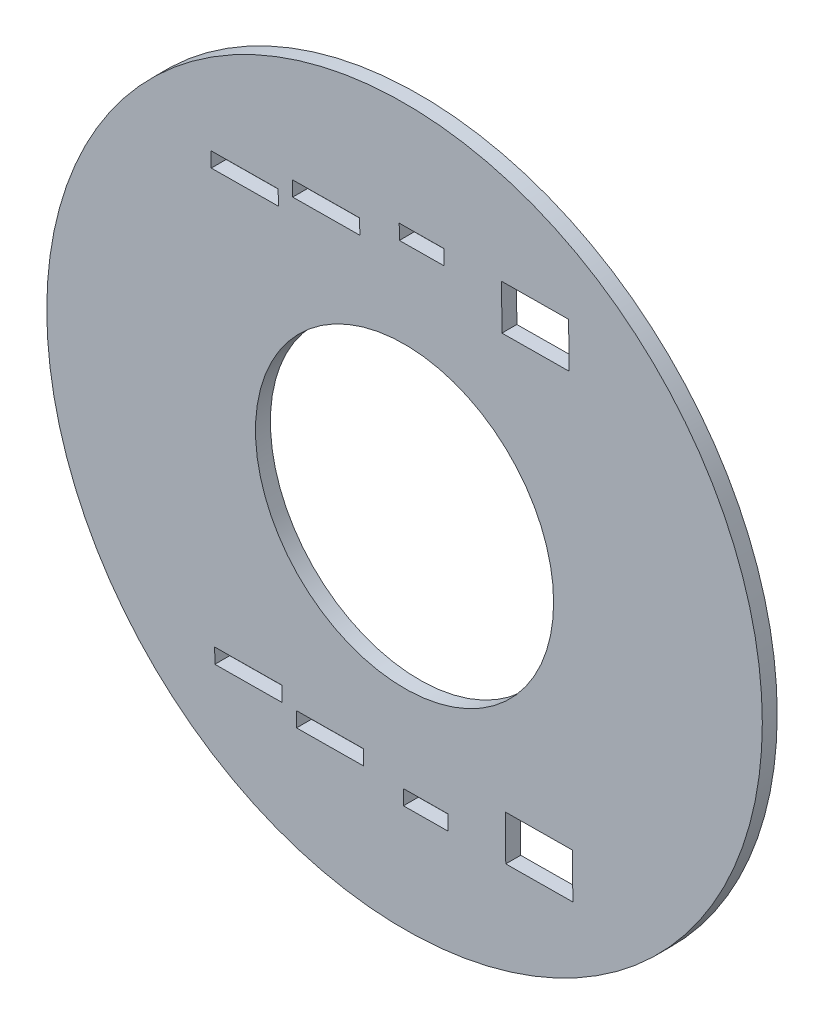
ISO-10303-21;
HEADER;
FILE_DESCRIPTION(('STEP AP214'),'2;1');
FILE_NAME('part.step','',(''),(''),'','','');
FILE_SCHEMA(('AUTOMOTIVE_DESIGN { 1 0 10303 214 1 1 1 1 }'));
ENDSEC;
DATA;
#1=APPLICATION_CONTEXT('core data for automotive mechanical design processes');
#2=APPLICATION_PROTOCOL_DEFINITION('international standard','automotive_design',2000,#1);
#3=PRODUCT_CONTEXT('',#1,'mechanical');
#4=PRODUCT('Part','Part','',(#3));
#5=PRODUCT_RELATED_PRODUCT_CATEGORY('part','',(#4));
#6=PRODUCT_DEFINITION_FORMATION('','',#4);
#7=PRODUCT_DEFINITION_CONTEXT('part definition',#1,'design');
#8=PRODUCT_DEFINITION('design','',#6,#7);
#9=PRODUCT_DEFINITION_SHAPE('','',#8);
#10=(LENGTH_UNIT() NAMED_UNIT(*) SI_UNIT(.MILLI.,.METRE.));
#11=(NAMED_UNIT(*) PLANE_ANGLE_UNIT() SI_UNIT($,.RADIAN.));
#12=(NAMED_UNIT(*) SI_UNIT($,.STERADIAN.) SOLID_ANGLE_UNIT());
#13=UNCERTAINTY_MEASURE_WITH_UNIT(LENGTH_MEASURE(1.E-05),#10,'distance_accuracy_value','');
#14=(GEOMETRIC_REPRESENTATION_CONTEXT(3) GLOBAL_UNCERTAINTY_ASSIGNED_CONTEXT((#13)) GLOBAL_UNIT_ASSIGNED_CONTEXT((#10,
#11,#12)) REPRESENTATION_CONTEXT('',''));
#15=CARTESIAN_POINT('',(0.,0.,0.));
#16=DIRECTION('',(0.,0.,1.));
#17=DIRECTION('',(1.,0.,0.));
#18=AXIS2_PLACEMENT_3D('',#15,#16,#17);
#19=CARTESIAN_POINT('',(0.,0.,3.175));
#20=DIRECTION('',(0.,0.,1.));
#21=DIRECTION('',(1.,0.,0.));
#22=AXIS2_PLACEMENT_3D('',#19,#20,#21);
#23=PLANE('',#22);
#24=DIRECTION('',(0.999964969742603,0.00837014263177071,0.));
#25=VECTOR('',#24,1.);
#26=CARTESIAN_POINT('',(0.447896842525139,-53.5093811763047,3.175));
#27=LINE('',#26,#25);
#28=CARTESIAN_POINT('',(21.5577069753137,-53.3326828647763,3.175));
#29=VERTEX_POINT('',#28);
#30=CARTESIAN_POINT('',(35.8447064805111,-53.2130944519249,3.175));
#31=VERTEX_POINT('',#30);
#32=EDGE_CURVE('E446',#29,#31,#27,.T.);
#33=ORIENTED_EDGE('',*,*,#32,.F.);
#34=DIRECTION('',(-0.00837014263177083,0.999964969742602,0.));
#35=VECTOR('',#34,1.);
#36=CARTESIAN_POINT('',(21.1098101327886,0.176698311528376,3.175));
#37=LINE('',#36,#35);
#38=CARTESIAN_POINT('',(21.4779813667463,-43.8080165279722,3.175));
#39=VERTEX_POINT('',#38);
#40=EDGE_CURVE('E475',#29,#39,#37,.T.);
#41=ORIENTED_EDGE('',*,*,#40,.T.);
#42=DIRECTION('',(-0.999964969742602,-0.00837014263177071,0.));
#43=VECTOR('',#42,1.);
#44=CARTESIAN_POINT('',(0.368171233957474,-43.9847148395006,3.175));
#45=LINE('',#44,#43);
#46=CARTESIAN_POINT('',(35.7649808719438,-43.6884281151208,3.175));
#47=VERTEX_POINT('',#46);
#48=EDGE_CURVE('E451',#47,#39,#45,.T.);
#49=ORIENTED_EDGE('',*,*,#48,.F.);
#50=DIRECTION('',(-0.00837014263177083,0.999964969742602,0.));
#51=VECTOR('',#50,1.);
#52=CARTESIAN_POINT('',(35.396809637986,0.296286724379802,3.175));
#53=LINE('',#52,#51);
#54=EDGE_CURVE('E472',#31,#47,#53,.T.);
#55=ORIENTED_EDGE('',*,*,#54,.F.);
#56=EDGE_LOOP('',(#33,#41,#49,#55));
#57=FACE_BOUND('',#56,.T.);
#58=CARTESIAN_POINT('',(-26.1453503172451,-44.2066445708103,3.175));
#59=VERTEX_POINT('',#58);
#60=CARTESIAN_POINT('',(-40.4323498224425,-44.3262329836617,3.175));
#61=VERTEX_POINT('',#60);
#62=EDGE_CURVE('E449',#59,#61,#45,.T.);
#63=ORIENTED_EDGE('',*,*,#62,.F.);
#64=DIRECTION('',(-0.00837014263177083,0.999964969742602,0.));
#65=VECTOR('',#64,1.);
#66=CARTESIAN_POINT('',(-26.5135215512025,-0.221929731309707,3.175));
#67=LINE('',#66,#65);
#68=CARTESIAN_POINT('',(-26.1187751143892,-47.381533349743,3.175));
#69=VERTEX_POINT('',#68);
#70=EDGE_CURVE('E455',#69,#59,#67,.T.);
#71=ORIENTED_EDGE('',*,*,#70,.F.);
#72=DIRECTION('',(-0.999964969742602,-0.00837014263177071,0.));
#73=VECTOR('',#72,1.);
#74=CARTESIAN_POINT('',(0.394746436813346,-47.1596036184333,3.175));
#75=LINE('',#74,#73);
#76=CARTESIAN_POINT('',(-40.4057746195866,-47.5011217625945,3.175));
#77=VERTEX_POINT('',#76);
#78=EDGE_CURVE('E415',#69,#77,#75,.T.);
#79=ORIENTED_EDGE('',*,*,#78,.T.);
#80=DIRECTION('',(-0.00837014263177083,0.999964969742602,0.));
#81=VECTOR('',#80,1.);
#82=CARTESIAN_POINT('',(-40.8005210564,-0.341518144161133,3.175));
#83=LINE('',#82,#81);
#84=EDGE_CURVE('E452',#77,#61,#83,.T.);
#85=ORIENTED_EDGE('',*,*,#84,.T.);
#86=EDGE_LOOP('',(#63,#71,#79,#85));
#87=FACE_BOUND('',#86,.T.);
#88=CARTESIAN_POINT('',(0.,0.,3.175));
#89=DIRECTION('',(0.,0.,1.));
#90=DIRECTION('',(1.,0.,0.));
#91=AXIS2_PLACEMENT_3D('',#88,#89,#90);
#92=CIRCLE('',#91,76.2);
#93=CARTESIAN_POINT('',(76.2,0.,3.175));
#94=VERTEX_POINT('',#93);
#95=EDGE_CURVE('E488',#94,#94,#92,.T.);
#96=ORIENTED_EDGE('',*,*,#95,.T.);
#97=EDGE_LOOP('',(#96));
#98=FACE_BOUND('',#97,.T.);
#99=CARTESIAN_POINT('',(0.,0.,3.175));
#100=DIRECTION('',(0.,0.,1.));
#101=DIRECTION('',(1.,0.,0.));
#102=AXIS2_PLACEMENT_3D('',#99,#100,#101);
#103=CIRCLE('',#102,31.75);
#104=CARTESIAN_POINT('',(31.75,0.,3.175));
#105=VERTEX_POINT('',#104);
#106=EDGE_CURVE('E482',#105,#105,#103,.T.);
#107=ORIENTED_EDGE('',*,*,#106,.F.);
#108=EDGE_LOOP('',(#107));
#109=FACE_BOUND('',#108,.T.);
#110=DIRECTION('',(-0.999964969742602,-0.00837014263177077,0.));
#111=VECTOR('',#110,1.);
#112=CARTESIAN_POINT('',(0.421321639669305,-50.3344923973762,3.175));
#113=LINE('',#112,#111);
#114=CARTESIAN_POINT('',(-8.71521697122859,-50.4109692077124,3.175));
#115=VERTEX_POINT('',#114);
#116=CARTESIAN_POINT('',(-23.002216476426,-50.5305576205638,3.175));
#117=VERTEX_POINT('',#116);
#118=EDGE_CURVE('E464',#115,#117,#113,.T.);
#119=ORIENTED_EDGE('',*,*,#118,.T.);
#120=DIRECTION('',(-0.00837014263177088,0.999964969742603,0.));
#121=VECTOR('',#120,1.);
#122=CARTESIAN_POINT('',(-23.4235381160953,-0.196065223187675,3.175));
#123=LINE('',#122,#121);
#124=CARTESIAN_POINT('',(-23.0287916792819,-47.3556688416311,3.175));
#125=VERTEX_POINT('',#124);
#126=EDGE_CURVE('E459',#117,#125,#123,.T.);
#127=ORIENTED_EDGE('',*,*,#126,.T.);
#128=DIRECTION('',(-0.999964969742602,-0.00837014263177077,0.));
#129=VECTOR('',#128,1.);
#130=CARTESIAN_POINT('',(0.394746436813433,-47.1596036184434,3.175));
#131=LINE('',#130,#129);
#132=CARTESIAN_POINT('',(-8.74179217408447,-47.2360804287796,3.175));
#133=VERTEX_POINT('',#132);
#134=EDGE_CURVE('E462',#133,#125,#131,.T.);
#135=ORIENTED_EDGE('',*,*,#134,.F.);
#136=DIRECTION('',(-0.00837014263177088,0.999964969742603,0.));
#137=VECTOR('',#136,1.);
#138=CARTESIAN_POINT('',(-9.1365386108979,-0.0764768103362483,3.175));
#139=LINE('',#138,#137);
#140=EDGE_CURVE('E457',#115,#133,#139,.T.);
#141=ORIENTED_EDGE('',*,*,#140,.F.);
#142=EDGE_LOOP('',(#119,#127,#135,#141));
#143=FACE_BOUND('',#142,.T.);
#144=DIRECTION('',(-0.00837014263177083,0.999964969742602,0.));
#145=VECTOR('',#144,1.);
#146=CARTESIAN_POINT('',(-0.68414385932527,-0.00572658228685418,3.175));
#147=LINE('',#146,#145);
#148=CARTESIAN_POINT('',(-0.236247016800126,-53.5151077585916,3.175));
#149=VERTEX_POINT('',#148);
#150=CARTESIAN_POINT('',(-0.262822219655998,-50.3402189796588,3.175));
#151=VERTEX_POINT('',#150);
#152=EDGE_CURVE('E469',#149,#151,#147,.T.);
#153=ORIENTED_EDGE('',*,*,#152,.T.);
#154=DIRECTION('',(0.999964969742603,0.00837014263177071,0.));
#155=VECTOR('',#154,1.);
#156=CARTESIAN_POINT('',(0.421321639669267,-50.3344923973719,3.175));
#157=LINE('',#156,#155);
#158=CARTESIAN_POINT('',(9.26184411714232,-50.2604933710912,3.175));
#159=VERTEX_POINT('',#158);
#160=EDGE_CURVE('E478',#151,#159,#157,.T.);
#161=ORIENTED_EDGE('',*,*,#160,.T.);
#162=DIRECTION('',(-0.00837014263177083,0.999964969742602,0.));
#163=VECTOR('',#162,1.);
#164=CARTESIAN_POINT('',(8.84052247747304,0.0739990262807631,3.175));
#165=LINE('',#164,#163);
#166=CARTESIAN_POINT('',(9.28841931999819,-53.4353821500239,3.175));
#167=VERTEX_POINT('',#166);
#168=EDGE_CURVE('E467',#167,#159,#165,.T.);
#169=ORIENTED_EDGE('',*,*,#168,.F.);
#170=EDGE_CURVE('E448',#149,#167,#27,.T.);
#171=ORIENTED_EDGE('',*,*,#170,.F.);
#172=EDGE_LOOP('',(#153,#161,#169,#171));
#173=FACE_BOUND('',#172,.T.);
#174=DIRECTION('',(-0.00837014263175822,0.999964969742603,0.));
#175=VECTOR('',#174,1.);
#176=CARTESIAN_POINT('',(-26.5135215512025,-0.221929731309373,3.175));
#177=LINE('',#176,#175);
#178=CARTESIAN_POINT('',(-26.8816927851594,43.7627851081907,3.175));
#179=VERTEX_POINT('',#178);
#180=CARTESIAN_POINT('',(-26.9082679880153,46.9376738871234,3.175));
#181=VERTEX_POINT('',#180);
#182=EDGE_CURVE('E261',#179,#181,#177,.T.);
#183=ORIENTED_EDGE('',*,*,#182,.F.);
#184=DIRECTION('',(-0.999964969742603,-0.00837014263175817,0.));
#185=VECTOR('',#184,1.);
#186=CARTESIAN_POINT('',(-0.368171233956917,43.9847148395001,3.175));
#187=LINE('',#186,#185);
#188=CARTESIAN_POINT('',(-41.1686922903569,43.6431966953394,3.175));
#189=VERTEX_POINT('',#188);
#190=EDGE_CURVE('E334',#179,#189,#187,.T.);
#191=ORIENTED_EDGE('',*,*,#190,.T.);
#192=DIRECTION('',(-0.00837014263175822,0.999964969742603,0.));
#193=VECTOR('',#192,1.);
#194=CARTESIAN_POINT('',(-40.8005210563999,-0.341518144160618,3.175));
#195=LINE('',#194,#193);
#196=CARTESIAN_POINT('',(-41.1952674932127,46.8180854742722,3.175));
#197=VERTEX_POINT('',#196);
#198=EDGE_CURVE('E338',#189,#197,#195,.T.);
#199=ORIENTED_EDGE('',*,*,#198,.T.);
#200=DIRECTION('',(-0.999964969742603,-0.00837014263175817,0.));
#201=VECTOR('',#200,1.);
#202=CARTESIAN_POINT('',(-0.394746436812749,47.1596036184328,3.175));
#203=LINE('',#202,#201);
#204=EDGE_CURVE('E252',#181,#197,#203,.T.);
#205=ORIENTED_EDGE('',*,*,#204,.F.);
#206=EDGE_LOOP('',(#183,#191,#199,#205));
#207=FACE_BOUND('',#206,.T.);
#208=DIRECTION('',(-0.00837014263175822,0.999964969742603,0.));
#209=VECTOR('',#208,1.);
#210=CARTESIAN_POINT('',(21.1098101327889,0.176698311528113,3.175));
#211=LINE('',#210,#209);
#212=CARTESIAN_POINT('',(20.741638898832,44.1614131510282,3.175));
#213=VERTEX_POINT('',#212);
#214=CARTESIAN_POINT('',(20.6619132902645,53.6860794878264,3.175));
#215=VERTEX_POINT('',#214);
#216=EDGE_CURVE('E359',#213,#215,#211,.T.);
#217=ORIENTED_EDGE('',*,*,#216,.T.);
#218=DIRECTION('',(0.999964969742603,0.00837014263175817,0.));
#219=VECTOR('',#218,1.);
#220=CARTESIAN_POINT('',(-0.447896842524414,53.5093811762983,3.175));
#221=LINE('',#220,#219);
#222=CARTESIAN_POINT('',(34.948912795462,53.8056679006777,3.175));
#223=VERTEX_POINT('',#222);
#224=EDGE_CURVE('E330',#215,#223,#221,.T.);
#225=ORIENTED_EDGE('',*,*,#224,.T.);
#226=DIRECTION('',(-0.00837014263175822,0.999964969742603,0.));
#227=VECTOR('',#226,1.);
#228=CARTESIAN_POINT('',(35.3968096379864,0.296286724379359,3.175));
#229=LINE('',#228,#227);
#230=CARTESIAN_POINT('',(35.0286384040294,44.2810015638794,3.175));
#231=VERTEX_POINT('',#230);
#232=EDGE_CURVE('E357',#231,#223,#229,.T.);
#233=ORIENTED_EDGE('',*,*,#232,.F.);
#234=EDGE_CURVE('E337',#231,#213,#187,.T.);
#235=ORIENTED_EDGE('',*,*,#234,.T.);
#236=EDGE_LOOP('',(#217,#225,#233,#235));
#237=FACE_BOUND('',#236,.T.);
#238=DIRECTION('',(-0.999964969742603,-0.00837014263175822,0.));
#239=VECTOR('',#238,1.);
#240=CARTESIAN_POINT('',(-0.394746436812752,47.1596036184328,3.175));
#241=LINE('',#240,#239);
#242=CARTESIAN_POINT('',(-9.53128504771036,47.0831268080967,3.175));
#243=VERTEX_POINT('',#242);
#244=CARTESIAN_POINT('',(-23.8182845529078,46.9635383952455,3.175));
#245=VERTEX_POINT('',#244);
#246=EDGE_CURVE('E347',#243,#245,#241,.T.);
#247=ORIENTED_EDGE('',*,*,#246,.T.);
#248=DIRECTION('',(-0.00837014263175822,0.999964969742603,0.));
#249=VECTOR('',#248,1.);
#250=CARTESIAN_POINT('',(-23.423538116095,-0.196065223187376,3.175));
#251=LINE('',#250,#249);
#252=CARTESIAN_POINT('',(-23.8448597557636,50.1384271741782,3.175));
#253=VERTEX_POINT('',#252);
#254=EDGE_CURVE('E344',#245,#253,#251,.T.);
#255=ORIENTED_EDGE('',*,*,#254,.T.);
#256=DIRECTION('',(-0.999964969742603,-0.00837014263175822,0.));
#257=VECTOR('',#256,1.);
#258=CARTESIAN_POINT('',(-0.421321639668585,50.3344923973656,3.175));
#259=LINE('',#258,#257);
#260=CARTESIAN_POINT('',(-9.55786025056619,50.2580155870295,3.175));
#261=VERTEX_POINT('',#260);
#262=EDGE_CURVE('E350',#261,#253,#259,.T.);
#263=ORIENTED_EDGE('',*,*,#262,.F.);
#264=DIRECTION('',(-0.00837014263175822,0.999964969742603,0.));
#265=VECTOR('',#264,1.);
#266=CARTESIAN_POINT('',(-9.13653861089761,-0.0764768103361302,3.175));
#267=LINE('',#266,#265);
#268=EDGE_CURVE('E342',#243,#261,#267,.T.);
#269=ORIENTED_EDGE('',*,*,#268,.F.);
#270=EDGE_LOOP('',(#247,#255,#263,#269));
#271=FACE_BOUND('',#270,.T.);
#272=DIRECTION('',(0.999964969742603,0.00837014263175817,0.));
#273=VECTOR('',#272,1.);
#274=CARTESIAN_POINT('',(-0.421321639668582,50.3344923973656,3.175));
#275=LINE('',#274,#273);
#276=CARTESIAN_POINT('',(-1.1054654989935,50.3287658150787,3.175));
#277=VERTEX_POINT('',#276);
#278=CARTESIAN_POINT('',(8.41920083780481,50.4084914236462,3.175));
#279=VERTEX_POINT('',#278);
#280=EDGE_CURVE('E362',#277,#279,#275,.T.);
#281=ORIENTED_EDGE('',*,*,#280,.F.);
#282=DIRECTION('',(-0.00837014263175822,0.999964969742603,0.));
#283=VECTOR('',#282,1.);
#284=CARTESIAN_POINT('',(-0.684143859324913,-0.00572658228684257,3.175));
#285=LINE('',#284,#283);
#286=CARTESIAN_POINT('',(-1.13204070184933,53.5036545940115,3.175));
#287=VERTEX_POINT('',#286);
#288=EDGE_CURVE('E354',#277,#287,#285,.T.);
#289=ORIENTED_EDGE('',*,*,#288,.T.);
#290=CARTESIAN_POINT('',(8.39262563494898,53.583380202579,3.175));
#291=VERTEX_POINT('',#290);
#292=EDGE_CURVE('E333',#287,#291,#221,.T.);
#293=ORIENTED_EDGE('',*,*,#292,.T.);
#294=DIRECTION('',(-0.00837014263175822,0.999964969742603,0.));
#295=VECTOR('',#294,1.);
#296=CARTESIAN_POINT('',(8.8405224774734,0.0739990262806547,3.175));
#297=LINE('',#296,#295);
#298=EDGE_CURVE('E352',#279,#291,#297,.T.);
#299=ORIENTED_EDGE('',*,*,#298,.F.);
#300=EDGE_LOOP('',(#281,#289,#293,#299));
#301=FACE_BOUND('',#300,.T.);
#302=ADVANCED_FACE('F33',(#57,#87,#98,#109,#143,#173,#207,#237,#271,#301),#23,.T.);
#303=CARTESIAN_POINT('',(0.,0.,0.));
#304=DIRECTION('',(0.,0.,1.));
#305=DIRECTION('',(1.,0.,0.));
#306=AXIS2_PLACEMENT_3D('',#303,#304,#305);
#307=PLANE('',#306);
#308=DIRECTION('',(0.999964969742603,0.00837014263175817,0.));
#309=VECTOR('',#308,1.);
#310=CARTESIAN_POINT('',(-0.447896842524414,53.5093811762983,0.));
#311=LINE('',#310,#309);
#312=CARTESIAN_POINT('',(-1.13204070184933,53.5036545940115,0.));
#313=VERTEX_POINT('',#312);
#314=CARTESIAN_POINT('',(8.39262563494898,53.583380202579,0.));
#315=VERTEX_POINT('',#314);
#316=EDGE_CURVE('E329',#313,#315,#311,.T.);
#317=ORIENTED_EDGE('',*,*,#316,.F.);
#318=DIRECTION('',(0.00837014263175817,-0.999964969742603,0.));
#319=VECTOR('',#318,1.);
#320=CARTESIAN_POINT('',(-1.13204070184933,53.5036545940115,0.));
#321=LINE('',#320,#319);
#322=CARTESIAN_POINT('',(-1.10546549899351,50.3287658150788,0.));
#323=VERTEX_POINT('',#322);
#324=EDGE_CURVE('E310',#313,#323,#321,.T.);
#325=ORIENTED_EDGE('',*,*,#324,.T.);
#326=DIRECTION('',(0.999964969742603,0.00837014263175822,0.));
#327=VECTOR('',#326,1.);
#328=CARTESIAN_POINT('',(-30.9883595083624,50.0786329677526,0.));
#329=LINE('',#328,#327);
#330=CARTESIAN_POINT('',(8.41920083780479,50.4084914236462,0.));
#331=VERTEX_POINT('',#330);
#332=EDGE_CURVE('E253',#323,#331,#329,.T.);
#333=ORIENTED_EDGE('',*,*,#332,.T.);
#334=DIRECTION('',(0.00837014263175817,-0.999964969742603,0.));
#335=VECTOR('',#334,1.);
#336=CARTESIAN_POINT('',(8.39262563494898,53.583380202579,0.));
#337=LINE('',#336,#335);
#338=EDGE_CURVE('E308',#315,#331,#337,.T.);
#339=ORIENTED_EDGE('',*,*,#338,.F.);
#340=EDGE_LOOP('',(#317,#325,#333,#339));
#341=FACE_BOUND('',#340,.T.);
#342=CARTESIAN_POINT('',(20.6619132902645,53.6860794878264,0.));
#343=VERTEX_POINT('',#342);
#344=CARTESIAN_POINT('',(34.948912795462,53.8056679006777,6.03683769639929E-13));
#345=VERTEX_POINT('',#344);
#346=EDGE_CURVE('E327',#343,#345,#311,.T.);
#347=ORIENTED_EDGE('',*,*,#346,.F.);
#348=DIRECTION('',(0.00837014263175817,-0.999964969742603,0.));
#349=VECTOR('',#348,1.);
#350=CARTESIAN_POINT('',(20.6619132902645,53.6860794878264,0.));
#351=LINE('',#350,#349);
#352=CARTESIAN_POINT('',(20.741638898832,44.1614131510281,0.));
#353=VERTEX_POINT('',#352);
#354=EDGE_CURVE('E306',#343,#353,#351,.T.);
#355=ORIENTED_EDGE('',*,*,#354,.T.);
#356=DIRECTION('',(-0.999964969742603,-0.00837014263175817,0.));
#357=VECTOR('',#356,1.);
#358=CARTESIAN_POINT('',(-0.368171233956917,43.9847148395001,0.));
#359=LINE('',#358,#357);
#360=CARTESIAN_POINT('',(35.0286384040294,44.2810015638794,0.));
#361=VERTEX_POINT('',#360);
#362=EDGE_CURVE('E41',#361,#353,#359,.T.);
#363=ORIENTED_EDGE('',*,*,#362,.F.);
#364=DIRECTION('',(0.00837014263175817,-0.999964969742603,0.));
#365=VECTOR('',#364,1.);
#366=CARTESIAN_POINT('',(34.948912795462,53.8056679006777,6.03683769639929E-13));
#367=LINE('',#366,#365);
#368=EDGE_CURVE('E319',#345,#361,#367,.T.);
#369=ORIENTED_EDGE('',*,*,#368,.F.);
#370=EDGE_LOOP('',(#347,#355,#363,#369));
#371=FACE_BOUND('',#370,.T.);
#372=CARTESIAN_POINT('',(0.,0.,0.));
#373=DIRECTION('',(0.,0.,1.));
#374=DIRECTION('',(1.,0.,0.));
#375=AXIS2_PLACEMENT_3D('',#372,#373,#374);
#376=CIRCLE('',#375,76.2);
#377=CARTESIAN_POINT('',(76.2,0.,0.));
#378=VERTEX_POINT('',#377);
#379=EDGE_CURVE('E485',#378,#378,#376,.T.);
#380=ORIENTED_EDGE('',*,*,#379,.F.);
#381=EDGE_LOOP('',(#380));
#382=FACE_BOUND('',#381,.T.);
#383=DIRECTION('',(0.00837014263175822,-0.999964969742603,0.));
#384=VECTOR('',#383,1.);
#385=CARTESIAN_POINT('',(-9.55786025056619,50.2580155870295,0.));
#386=LINE('',#385,#384);
#387=CARTESIAN_POINT('',(-9.55786025056619,50.2580155870295,0.));
#388=VERTEX_POINT('',#387);
#389=CARTESIAN_POINT('',(-9.53128504770669,47.0831268080967,0.));
#390=VERTEX_POINT('',#389);
#391=EDGE_CURVE('E295',#388,#390,#386,.T.);
#392=ORIENTED_EDGE('',*,*,#391,.F.);
#393=DIRECTION('',(-0.999964969742603,-0.00837014263175822,0.));
#394=VECTOR('',#393,1.);
#395=CARTESIAN_POINT('',(-0.421321639668585,50.3344923973656,0.));
#396=LINE('',#395,#394);
#397=CARTESIAN_POINT('',(-23.8448597557636,50.1384271741782,0.));
#398=VERTEX_POINT('',#397);
#399=EDGE_CURVE('E11',#388,#398,#396,.T.);
#400=ORIENTED_EDGE('',*,*,#399,.T.);
#401=DIRECTION('',(0.00837014263175822,-0.999964969742603,0.));
#402=VECTOR('',#401,1.);
#403=CARTESIAN_POINT('',(-23.8448597557636,50.1384271741782,0.));
#404=LINE('',#403,#402);
#405=CARTESIAN_POINT('',(-23.8182845529078,46.9635383952454,0.));
#406=VERTEX_POINT('',#405);
#407=EDGE_CURVE('E289',#398,#406,#404,.T.);
#408=ORIENTED_EDGE('',*,*,#407,.T.);
#409=DIRECTION('',(0.999964969742603,0.00837014263175823,0.));
#410=VECTOR('',#409,1.);
#411=CARTESIAN_POINT('',(-60.2446001668093,46.6586342571372,0.));
#412=LINE('',#411,#410);
#413=EDGE_CURVE('E275',#406,#390,#412,.T.);
#414=ORIENTED_EDGE('',*,*,#413,.T.);
#415=EDGE_LOOP('',(#392,#400,#408,#414));
#416=FACE_BOUND('',#415,.T.);
#417=CARTESIAN_POINT('',(0.,0.,0.));
#418=DIRECTION('',(0.,0.,1.));
#419=DIRECTION('',(1.,0.,0.));
#420=AXIS2_PLACEMENT_3D('',#417,#418,#419);
#421=CIRCLE('',#420,31.75);
#422=CARTESIAN_POINT('',(31.75,0.,0.));
#423=VERTEX_POINT('',#422);
#424=EDGE_CURVE('E481',#423,#423,#421,.T.);
#425=ORIENTED_EDGE('',*,*,#424,.T.);
#426=EDGE_LOOP('',(#425));
#427=FACE_BOUND('',#426,.T.);
#428=DIRECTION('',(0.00837014263177072,-0.999964969742603,0.));
#429=VECTOR('',#428,1.);
#430=CARTESIAN_POINT('',(-40.4323498224425,-44.3262329836617,0.));
#431=LINE('',#430,#429);
#432=CARTESIAN_POINT('',(-40.4323498224425,-44.3262329836617,0.));
#433=VERTEX_POINT('',#432);
#434=CARTESIAN_POINT('',(-40.4057746195866,-47.5011217625945,0.));
#435=VERTEX_POINT('',#434);
#436=EDGE_CURVE('E372',#433,#435,#431,.T.);
#437=ORIENTED_EDGE('',*,*,#436,.T.);
#438=DIRECTION('',(0.999964969742603,0.00837014263177088,0.));
#439=VECTOR('',#438,1.);
#440=CARTESIAN_POINT('',(-30.1722914318806,-47.4154630480568,0.));
#441=LINE('',#440,#439);
#442=CARTESIAN_POINT('',(-26.1187751143891,-47.3815333497531,0.));
#443=VERTEX_POINT('',#442);
#444=EDGE_CURVE('E382',#435,#443,#441,.T.);
#445=ORIENTED_EDGE('',*,*,#444,.T.);
#446=DIRECTION('',(0.00837014263177072,-0.999964969742603,0.));
#447=VECTOR('',#446,1.);
#448=CARTESIAN_POINT('',(-26.1453503172451,-44.2066445708103,0.));
#449=LINE('',#448,#447);
#450=CARTESIAN_POINT('',(-26.1453503172451,-44.2066445708103,0.));
#451=VERTEX_POINT('',#450);
#452=EDGE_CURVE('E380',#451,#443,#449,.T.);
#453=ORIENTED_EDGE('',*,*,#452,.F.);
#454=DIRECTION('',(-0.999964969742602,-0.00837014263177071,0.));
#455=VECTOR('',#454,1.);
#456=CARTESIAN_POINT('',(0.368171233957474,-43.9847148395006,0.));
#457=LINE('',#456,#455);
#458=EDGE_CURVE('E491',#451,#433,#457,.T.);
#459=ORIENTED_EDGE('',*,*,#458,.T.);
#460=EDGE_LOOP('',(#437,#445,#453,#459));
#461=FACE_BOUND('',#460,.T.);
#462=DIRECTION('',(-0.999964969742602,-0.00837014263177077,0.));
#463=VECTOR('',#462,1.);
#464=CARTESIAN_POINT('',(0.421321639669305,-50.3344923973762,0.));
#465=LINE('',#464,#463);
#466=CARTESIAN_POINT('',(-8.7152169712286,-50.4109692077124,0.));
#467=VERTEX_POINT('',#466);
#468=CARTESIAN_POINT('',(-23.002216476426,-50.5305576205638,0.));
#469=VERTEX_POINT('',#468);
#470=EDGE_CURVE('E497',#467,#469,#465,.T.);
#471=ORIENTED_EDGE('',*,*,#470,.F.);
#472=DIRECTION('',(0.00837014263177077,-0.999964969742603,0.));
#473=VECTOR('',#472,1.);
#474=CARTESIAN_POINT('',(-8.74179217408447,-47.2360804287796,0.));
#475=LINE('',#474,#473);
#476=CARTESIAN_POINT('',(-8.74179217408447,-47.2360804287796,0.));
#477=VERTEX_POINT('',#476);
#478=EDGE_CURVE('E402',#477,#467,#475,.T.);
#479=ORIENTED_EDGE('',*,*,#478,.F.);
#480=DIRECTION('',(0.999964969742603,0.00837014263177083,0.));
#481=VECTOR('',#480,1.);
#482=CARTESIAN_POINT('',(-59.4551072931832,-47.6605729797297,0.));
#483=LINE('',#482,#481);
#484=CARTESIAN_POINT('',(-23.0287916792819,-47.3556688416311,0.));
#485=VERTEX_POINT('',#484);
#486=EDGE_CURVE('E364',#485,#477,#483,.T.);
#487=ORIENTED_EDGE('',*,*,#486,.F.);
#488=DIRECTION('',(0.00837014263177077,-0.999964969742603,0.));
#489=VECTOR('',#488,1.);
#490=CARTESIAN_POINT('',(-23.0287916792819,-47.3556688416311,0.));
#491=LINE('',#490,#489);
#492=EDGE_CURVE('E395',#485,#469,#491,.T.);
#493=ORIENTED_EDGE('',*,*,#492,.T.);
#494=EDGE_LOOP('',(#471,#479,#487,#493));
#495=FACE_BOUND('',#494,.T.);
#496=DIRECTION('',(0.00837014263177072,-0.999964969742603,0.));
#497=VECTOR('',#496,1.);
#498=CARTESIAN_POINT('',(21.5311317724578,-50.1577940858436,0.));
#499=LINE('',#498,#497);
#500=CARTESIAN_POINT('',(21.4779813667463,-43.8080165279722,0.));
#501=VERTEX_POINT('',#500);
#502=CARTESIAN_POINT('',(21.5577069753137,-53.3326828647763,0.));
#503=VERTEX_POINT('',#502);
#504=EDGE_CURVE('E416',#501,#503,#499,.T.);
#505=ORIENTED_EDGE('',*,*,#504,.T.);
#506=DIRECTION('',(0.999964969742603,0.00837014263177071,0.));
#507=VECTOR('',#506,1.);
#508=CARTESIAN_POINT('',(0.447896842525139,-53.5093811763047,0.));
#509=LINE('',#508,#507);
#510=CARTESIAN_POINT('',(35.8447064805111,-53.2130944519249,6.31439345255558E-13));
#511=VERTEX_POINT('',#510);
#512=EDGE_CURVE('E442',#503,#511,#509,.T.);
#513=ORIENTED_EDGE('',*,*,#512,.T.);
#514=DIRECTION('',(0.00837014263177072,-0.999964969742603,0.));
#515=VECTOR('',#514,1.);
#516=CARTESIAN_POINT('',(35.8181312776553,-50.0382056729921,6.31439345255558E-13));
#517=LINE('',#516,#515);
#518=CARTESIAN_POINT('',(35.7649808719438,-43.6884281151208,0.));
#519=VERTEX_POINT('',#518);
#520=EDGE_CURVE('E432',#519,#511,#517,.T.);
#521=ORIENTED_EDGE('',*,*,#520,.F.);
#522=EDGE_CURVE('E494',#519,#501,#457,.T.);
#523=ORIENTED_EDGE('',*,*,#522,.T.);
#524=EDGE_LOOP('',(#505,#513,#521,#523));
#525=FACE_BOUND('',#524,.T.);
#526=DIRECTION('',(0.00837014263177072,-0.999964969742603,0.));
#527=VECTOR('',#526,1.);
#528=CARTESIAN_POINT('',(-0.262822219655998,-50.3402189796588,0.));
#529=LINE('',#528,#527);
#530=CARTESIAN_POINT('',(-0.262822219655998,-50.3402189796588,0.));
#531=VERTEX_POINT('',#530);
#532=CARTESIAN_POINT('',(-0.236247016800126,-53.5151077585916,0.));
#533=VERTEX_POINT('',#532);
#534=EDGE_CURVE('E421',#531,#533,#529,.T.);
#535=ORIENTED_EDGE('',*,*,#534,.T.);
#536=CARTESIAN_POINT('',(9.28841931999819,-53.4353821500239,0.));
#537=VERTEX_POINT('',#536);
#538=EDGE_CURVE('E445',#533,#537,#509,.T.);
#539=ORIENTED_EDGE('',*,*,#538,.T.);
#540=DIRECTION('',(0.00837014263177072,-0.999964969742603,0.));
#541=VECTOR('',#540,1.);
#542=CARTESIAN_POINT('',(9.26184411714232,-50.2604933710912,0.));
#543=LINE('',#542,#541);
#544=CARTESIAN_POINT('',(9.26184411714232,-50.2604933710912,0.));
#545=VERTEX_POINT('',#544);
#546=EDGE_CURVE('E418',#545,#537,#543,.T.);
#547=ORIENTED_EDGE('',*,*,#546,.F.);
#548=DIRECTION('',(0.999964969742603,0.00837014263177088,0.));
#549=VECTOR('',#548,1.);
#550=CARTESIAN_POINT('',(-30.1457162290248,-50.5903518269895,0.));
#551=LINE('',#550,#549);
#552=EDGE_CURVE('E411',#531,#545,#551,.T.);
#553=ORIENTED_EDGE('',*,*,#552,.F.);
#554=EDGE_LOOP('',(#535,#539,#547,#553));
#555=FACE_BOUND('',#554,.T.);
#556=DIRECTION('',(0.00837014263175817,-0.999964969742603,0.));
#557=VECTOR('',#556,1.);
#558=CARTESIAN_POINT('',(-26.9082679880153,46.9376738871234,0.));
#559=LINE('',#558,#557);
#560=CARTESIAN_POINT('',(-26.9082679880153,46.9376738871234,0.));
#561=VERTEX_POINT('',#560);
#562=CARTESIAN_POINT('',(-26.8816927851594,43.7627851081907,0.));
#563=VERTEX_POINT('',#562);
#564=EDGE_CURVE('E258',#561,#563,#559,.T.);
#565=ORIENTED_EDGE('',*,*,#564,.F.);
#566=DIRECTION('',(-0.999964969742603,-0.00837014263175817,0.));
#567=VECTOR('',#566,1.);
#568=CARTESIAN_POINT('',(-0.394746436812749,47.1596036184328,0.));
#569=LINE('',#568,#567);
#570=CARTESIAN_POINT('',(-41.1952674932127,46.8180854742722,0.));
#571=VERTEX_POINT('',#570);
#572=EDGE_CURVE('E241',#561,#571,#569,.T.);
#573=ORIENTED_EDGE('',*,*,#572,.T.);
#574=DIRECTION('',(0.00837014263175817,-0.999964969742603,0.));
#575=VECTOR('',#574,1.);
#576=CARTESIAN_POINT('',(-41.1952674932127,46.8180854742722,0.));
#577=LINE('',#576,#575);
#578=CARTESIAN_POINT('',(-41.1686922903569,43.6431966953394,0.));
#579=VERTEX_POINT('',#578);
#580=EDGE_CURVE('E268',#571,#579,#577,.T.);
#581=ORIENTED_EDGE('',*,*,#580,.T.);
#582=EDGE_CURVE('E267',#563,#579,#359,.T.);
#583=ORIENTED_EDGE('',*,*,#582,.F.);
#584=EDGE_LOOP('',(#565,#573,#581,#583));
#585=FACE_BOUND('',#584,.T.);
#586=ADVANCED_FACE('F266',(#341,#371,#382,#416,#427,#461,#495,#525,#555,#585),#307,.F.);
#587=CARTESIAN_POINT('',(0.,0.,3.175));
#588=DIRECTION('',(0.,0.,-1.));
#589=DIRECTION('',(-1.,0.,0.));
#590=AXIS2_PLACEMENT_3D('',#587,#588,#589);
#591=CYLINDRICAL_SURFACE('',#590,76.2);
#592=ORIENTED_EDGE('',*,*,#95,.F.);
#593=EDGE_LOOP('',(#592));
#594=FACE_BOUND('',#593,.T.);
#595=ORIENTED_EDGE('',*,*,#379,.T.);
#596=EDGE_LOOP('',(#595));
#597=FACE_BOUND('',#596,.T.);
#598=ADVANCED_FACE('F35',(#594,#597),#591,.T.);
#599=CARTESIAN_POINT('',(0.,0.,3.175));
#600=DIRECTION('',(0.,0.,-1.));
#601=DIRECTION('',(-1.,0.,0.));
#602=AXIS2_PLACEMENT_3D('',#599,#600,#601);
#603=CYLINDRICAL_SURFACE('',#602,31.75);
#604=ORIENTED_EDGE('',*,*,#106,.T.);
#605=EDGE_LOOP('',(#604));
#606=FACE_BOUND('',#605,.T.);
#607=ORIENTED_EDGE('',*,*,#424,.F.);
#608=EDGE_LOOP('',(#607));
#609=FACE_BOUND('',#608,.T.);
#610=ADVANCED_FACE('F661',(#606,#609),#603,.F.);
#611=CARTESIAN_POINT('',(-59.4816824960391,-44.4856842007969,0.));
#612=DIRECTION('',(-0.00837014263177072,0.999964969742603,0.));
#613=DIRECTION('',(0.999964969742603,0.00837014263177083,0.));
#614=AXIS2_PLACEMENT_3D('',#611,#612,#613);
#615=PLANE('',#614);
#616=ORIENTED_EDGE('',*,*,#62,.T.);
#617=DIRECTION('',(0.,0.,1.));
#618=VECTOR('',#617,1.);
#619=CARTESIAN_POINT('',(-40.4323498224425,-44.3262329836617,0.));
#620=LINE('',#619,#618);
#621=EDGE_CURVE('E368',#433,#61,#620,.T.);
#622=ORIENTED_EDGE('',*,*,#621,.F.);
#623=ORIENTED_EDGE('',*,*,#458,.F.);
#624=DIRECTION('',(0.,0.,1.));
#625=VECTOR('',#624,1.);
#626=CARTESIAN_POINT('',(-26.1453503172451,-44.2066445708103,0.));
#627=LINE('',#626,#625);
#628=EDGE_CURVE('E365',#451,#59,#627,.T.);
#629=ORIENTED_EDGE('',*,*,#628,.T.);
#630=EDGE_LOOP('',(#616,#622,#623,#629));
#631=FACE_BOUND('',#630,.T.);
#632=ADVANCED_FACE('F663',(#631),#615,.F.);
#633=CARTESIAN_POINT('',(-59.4551072931832,-47.6605729797297,0.));
#634=DIRECTION('',(-0.00837014263177072,0.999964969742603,0.));
#635=DIRECTION('',(0.999964969742603,0.00837014263177083,0.));
#636=AXIS2_PLACEMENT_3D('',#633,#634,#635);
#637=PLANE('',#636);
#638=DIRECTION('',(0.,0.,1.));
#639=VECTOR('',#638,1.);
#640=CARTESIAN_POINT('',(-26.1187751143892,-47.381533349743,0.));
#641=LINE('',#640,#639);
#642=EDGE_CURVE('E373',#443,#69,#641,.T.);
#643=ORIENTED_EDGE('',*,*,#642,.F.);
#644=ORIENTED_EDGE('',*,*,#444,.F.);
#645=DIRECTION('',(0.,0.,1.));
#646=VECTOR('',#645,1.);
#647=CARTESIAN_POINT('',(-40.4057746195866,-47.5011217625945,0.));
#648=LINE('',#647,#646);
#649=EDGE_CURVE('E369',#435,#77,#648,.T.);
#650=ORIENTED_EDGE('',*,*,#649,.T.);
#651=ORIENTED_EDGE('',*,*,#78,.F.);
#652=EDGE_LOOP('',(#643,#644,#650,#651));
#653=FACE_BOUND('',#652,.T.);
#654=ADVANCED_FACE('F670',(#653),#637,.T.);
#655=CARTESIAN_POINT('',(-40.4323498224425,-44.3262329836617,0.));
#656=DIRECTION('',(0.999964969742603,0.00837014263177083,0.));
#657=DIRECTION('',(0.,0.,-1.));
#658=AXIS2_PLACEMENT_3D('',#655,#656,#657);
#659=PLANE('',#658);
#660=ORIENTED_EDGE('',*,*,#649,.F.);
#661=ORIENTED_EDGE('',*,*,#436,.F.);
#662=ORIENTED_EDGE('',*,*,#621,.T.);
#663=ORIENTED_EDGE('',*,*,#84,.F.);
#664=EDGE_LOOP('',(#660,#661,#662,#663));
#665=FACE_BOUND('',#664,.T.);
#666=ADVANCED_FACE('F825',(#665),#659,.T.);
#667=CARTESIAN_POINT('',(-26.1453503172451,-44.2066445708103,0.));
#668=DIRECTION('',(0.999964969742603,0.00837014263177083,0.));
#669=DIRECTION('',(0.00837014263177072,-0.999964969742603,0.));
#670=AXIS2_PLACEMENT_3D('',#667,#668,#669);
#671=PLANE('',#670);
#672=ORIENTED_EDGE('',*,*,#70,.T.);
#673=ORIENTED_EDGE('',*,*,#628,.F.);
#674=ORIENTED_EDGE('',*,*,#452,.T.);
#675=ORIENTED_EDGE('',*,*,#642,.T.);
#676=EDGE_LOOP('',(#672,#673,#674,#675));
#677=FACE_BOUND('',#676,.T.);
#678=ADVANCED_FACE('F822',(#677),#671,.F.);
#679=ORIENTED_EDGE('',*,*,#48,.T.);
#680=DIRECTION('',(0.,0.,1.));
#681=VECTOR('',#680,1.);
#682=CARTESIAN_POINT('',(21.4779813667463,-43.8080165279722,0.));
#683=LINE('',#682,#681);
#684=EDGE_CURVE('E376',#501,#39,#683,.T.);
#685=ORIENTED_EDGE('',*,*,#684,.F.);
#686=ORIENTED_EDGE('',*,*,#522,.F.);
#687=DIRECTION('',(0.,0.,1.));
#688=VECTOR('',#687,1.);
#689=CARTESIAN_POINT('',(35.7649808719438,-43.6884281151208,0.));
#690=LINE('',#689,#688);
#691=EDGE_CURVE('E383',#519,#47,#690,.T.);
#692=ORIENTED_EDGE('',*,*,#691,.T.);
#693=EDGE_LOOP('',(#679,#685,#686,#692));
#694=FACE_BOUND('',#693,.T.);
#695=ADVANCED_FACE('F646',(#694),#615,.F.);
#696=CARTESIAN_POINT('',(46.4814631720943,-53.1240601623828,-16.1766202995131));
#697=DIRECTION('',(0.00837014263177071,-0.999964969742603,0.));
#698=DIRECTION('',(-0.999964969742603,-0.00837014263177083,0.));
#699=AXIS2_PLACEMENT_3D('',#696,#697,#698);
#700=PLANE('',#699);
#701=ORIENTED_EDGE('',*,*,#32,.T.);
#702=DIRECTION('',(0.,0.,1.));
#703=VECTOR('',#702,1.);
#704=CARTESIAN_POINT('',(35.8447064805111,-53.2130944519249,6.31439345255558E-13));
#705=LINE('',#704,#703);
#706=EDGE_CURVE('E628',#511,#31,#705,.T.);
#707=ORIENTED_EDGE('',*,*,#706,.F.);
#708=ORIENTED_EDGE('',*,*,#512,.F.);
#709=DIRECTION('',(0.,0.,1.));
#710=VECTOR('',#709,1.);
#711=CARTESIAN_POINT('',(21.5577069753137,-53.3326828647763,0.));
#712=LINE('',#711,#710);
#713=EDGE_CURVE('E404',#503,#29,#712,.T.);
#714=ORIENTED_EDGE('',*,*,#713,.T.);
#715=EDGE_LOOP('',(#701,#707,#708,#714));
#716=FACE_BOUND('',#715,.T.);
#717=ADVANCED_FACE('F638',(#716),#700,.F.);
#718=CARTESIAN_POINT('',(35.8181312776553,-50.0382056729921,6.31439345255558E-13));
#719=DIRECTION('',(0.999964969742603,0.00837014263177083,0.));
#720=DIRECTION('',(0.00837014263177072,-0.999964969742603,0.));
#721=AXIS2_PLACEMENT_3D('',#718,#719,#720);
#722=PLANE('',#721);
#723=ORIENTED_EDGE('',*,*,#54,.T.);
#724=ORIENTED_EDGE('',*,*,#691,.F.);
#725=ORIENTED_EDGE('',*,*,#520,.T.);
#726=ORIENTED_EDGE('',*,*,#706,.T.);
#727=EDGE_LOOP('',(#723,#724,#725,#726));
#728=FACE_BOUND('',#727,.T.);
#729=ADVANCED_FACE('F635',(#728),#722,.F.);
#730=CARTESIAN_POINT('',(21.5311317724578,-50.1577940858436,0.));
#731=DIRECTION('',(0.999964969742603,0.00837014263177083,0.));
#732=DIRECTION('',(0.00837014263177072,-0.999964969742603,0.));
#733=AXIS2_PLACEMENT_3D('',#730,#731,#732);
#734=PLANE('',#733);
#735=ORIENTED_EDGE('',*,*,#713,.F.);
#736=ORIENTED_EDGE('',*,*,#504,.F.);
#737=ORIENTED_EDGE('',*,*,#684,.T.);
#738=ORIENTED_EDGE('',*,*,#40,.F.);
#739=EDGE_LOOP('',(#735,#736,#737,#738));
#740=FACE_BOUND('',#739,.T.);
#741=ADVANCED_FACE('F647',(#740),#734,.T.);
#742=CARTESIAN_POINT('',(-23.0287916792819,-47.3556688416311,0.));
#743=DIRECTION('',(0.999964969742603,0.00837014263177088,0.));
#744=DIRECTION('',(0.00837014263177077,-0.999964969742603,0.));
#745=AXIS2_PLACEMENT_3D('',#742,#743,#744);
#746=PLANE('',#745);
#747=DIRECTION('',(0.,0.,1.));
#748=VECTOR('',#747,1.);
#749=CARTESIAN_POINT('',(-23.002216476426,-50.5305576205638,0.));
#750=LINE('',#749,#748);
#751=EDGE_CURVE('E392',#469,#117,#750,.T.);
#752=ORIENTED_EDGE('',*,*,#751,.F.);
#753=ORIENTED_EDGE('',*,*,#492,.F.);
#754=DIRECTION('',(0.,0.,1.));
#755=VECTOR('',#754,1.);
#756=CARTESIAN_POINT('',(-23.0287916792819,-47.3556688416311,0.));
#757=LINE('',#756,#755);
#758=EDGE_CURVE('E391',#485,#125,#757,.T.);
#759=ORIENTED_EDGE('',*,*,#758,.T.);
#760=ORIENTED_EDGE('',*,*,#126,.F.);
#761=EDGE_LOOP('',(#752,#753,#759,#760));
#762=FACE_BOUND('',#761,.T.);
#763=ADVANCED_FACE('F649',(#762),#746,.T.);
#764=CARTESIAN_POINT('',(-8.74179217408447,-47.2360804287796,0.));
#765=DIRECTION('',(0.999964969742603,0.00837014263177088,0.));
#766=DIRECTION('',(0.00837014263177077,-0.999964969742603,0.));
#767=AXIS2_PLACEMENT_3D('',#764,#765,#766);
#768=PLANE('',#767);
#769=ORIENTED_EDGE('',*,*,#140,.T.);
#770=DIRECTION('',(0.,0.,1.));
#771=VECTOR('',#770,1.);
#772=CARTESIAN_POINT('',(-8.74179217408447,-47.2360804287796,0.));
#773=LINE('',#772,#771);
#774=EDGE_CURVE('E388',#477,#133,#773,.T.);
#775=ORIENTED_EDGE('',*,*,#774,.F.);
#776=ORIENTED_EDGE('',*,*,#478,.T.);
#777=DIRECTION('',(0.,0.,1.));
#778=VECTOR('',#777,1.);
#779=CARTESIAN_POINT('',(-8.7152169712286,-50.4109692077124,0.));
#780=LINE('',#779,#778);
#781=EDGE_CURVE('E396',#467,#115,#780,.T.);
#782=ORIENTED_EDGE('',*,*,#781,.T.);
#783=EDGE_LOOP('',(#769,#775,#776,#782));
#784=FACE_BOUND('',#783,.T.);
#785=ADVANCED_FACE('F655',(#784),#768,.F.);
#786=CARTESIAN_POINT('',(-59.4551072931834,-47.6605729797398,0.));
#787=DIRECTION('',(-0.00837014263177077,0.999964969742603,0.));
#788=DIRECTION('',(0.999964969742603,0.00837014263177088,0.));
#789=AXIS2_PLACEMENT_3D('',#786,#787,#788);
#790=PLANE('',#789);
#791=ORIENTED_EDGE('',*,*,#134,.T.);
#792=ORIENTED_EDGE('',*,*,#758,.F.);
#793=ORIENTED_EDGE('',*,*,#486,.T.);
#794=ORIENTED_EDGE('',*,*,#774,.T.);
#795=EDGE_LOOP('',(#791,#792,#793,#794));
#796=FACE_BOUND('',#795,.T.);
#797=ADVANCED_FACE('F690',(#796),#790,.F.);
#798=CARTESIAN_POINT('',(-59.4285320903275,-50.8354617586725,0.));
#799=DIRECTION('',(-0.00837014263177077,0.999964969742603,0.));
#800=DIRECTION('',(0.999964969742603,0.00837014263177088,0.));
#801=AXIS2_PLACEMENT_3D('',#798,#799,#800);
#802=PLANE('',#801);
#803=ORIENTED_EDGE('',*,*,#781,.F.);
#804=ORIENTED_EDGE('',*,*,#470,.T.);
#805=ORIENTED_EDGE('',*,*,#751,.T.);
#806=ORIENTED_EDGE('',*,*,#118,.F.);
#807=EDGE_LOOP('',(#803,#804,#805,#806));
#808=FACE_BOUND('',#807,.T.);
#809=ADVANCED_FACE('F684',(#808),#802,.T.);
#810=ORIENTED_EDGE('',*,*,#170,.T.);
#811=DIRECTION('',(0.,0.,1.));
#812=VECTOR('',#811,1.);
#813=CARTESIAN_POINT('',(9.28841931999819,-53.4353821500239,0.));
#814=LINE('',#813,#812);
#815=EDGE_CURVE('E437',#537,#167,#814,.T.);
#816=ORIENTED_EDGE('',*,*,#815,.F.);
#817=ORIENTED_EDGE('',*,*,#538,.F.);
#818=DIRECTION('',(0.,0.,1.));
#819=VECTOR('',#818,1.);
#820=CARTESIAN_POINT('',(-0.236247016800126,-53.5151077585916,0.));
#821=LINE('',#820,#819);
#822=EDGE_CURVE('E616',#533,#149,#821,.T.);
#823=ORIENTED_EDGE('',*,*,#822,.T.);
#824=EDGE_LOOP('',(#810,#816,#817,#823));
#825=FACE_BOUND('',#824,.T.);
#826=ADVANCED_FACE('F624',(#825),#700,.F.);
#827=CARTESIAN_POINT('',(46.4548879692385,-49.9491713834501,-16.1766202995131));
#828=DIRECTION('',(0.00837014263177071,-0.999964969742603,0.));
#829=DIRECTION('',(-0.999964969742603,-0.00837014263177083,0.));
#830=AXIS2_PLACEMENT_3D('',#827,#828,#829);
#831=PLANE('',#830);
#832=DIRECTION('',(0.,0.,1.));
#833=VECTOR('',#832,1.);
#834=CARTESIAN_POINT('',(-0.262822219655998,-50.3402189796588,0.));
#835=LINE('',#834,#833);
#836=EDGE_CURVE('E427',#531,#151,#835,.T.);
#837=ORIENTED_EDGE('',*,*,#836,.F.);
#838=ORIENTED_EDGE('',*,*,#552,.T.);
#839=DIRECTION('',(0.,0.,1.));
#840=VECTOR('',#839,1.);
#841=CARTESIAN_POINT('',(9.26184411714232,-50.2604933710912,0.));
#842=LINE('',#841,#840);
#843=EDGE_CURVE('E422',#545,#159,#842,.T.);
#844=ORIENTED_EDGE('',*,*,#843,.T.);
#845=ORIENTED_EDGE('',*,*,#160,.F.);
#846=EDGE_LOOP('',(#837,#838,#844,#845));
#847=FACE_BOUND('',#846,.T.);
#848=ADVANCED_FACE('F618',(#847),#831,.T.);
#849=CARTESIAN_POINT('',(-0.262822219655998,-50.3402189796588,0.));
#850=DIRECTION('',(0.999964969742603,0.00837014263177083,0.));
#851=DIRECTION('',(0.00837014263177072,-0.999964969742603,0.));
#852=AXIS2_PLACEMENT_3D('',#849,#850,#851);
#853=PLANE('',#852);
#854=ORIENTED_EDGE('',*,*,#822,.F.);
#855=ORIENTED_EDGE('',*,*,#534,.F.);
#856=ORIENTED_EDGE('',*,*,#836,.T.);
#857=ORIENTED_EDGE('',*,*,#152,.F.);
#858=EDGE_LOOP('',(#854,#855,#856,#857));
#859=FACE_BOUND('',#858,.T.);
#860=ADVANCED_FACE('F614',(#859),#853,.T.);
#861=CARTESIAN_POINT('',(9.26184411714232,-50.2604933710912,0.));
#862=DIRECTION('',(0.999964969742603,0.00837014263177083,0.));
#863=DIRECTION('',(0.00837014263177072,-0.999964969742603,0.));
#864=AXIS2_PLACEMENT_3D('',#861,#862,#863);
#865=PLANE('',#864);
#866=ORIENTED_EDGE('',*,*,#168,.T.);
#867=ORIENTED_EDGE('',*,*,#843,.F.);
#868=ORIENTED_EDGE('',*,*,#546,.T.);
#869=ORIENTED_EDGE('',*,*,#815,.T.);
#870=EDGE_LOOP('',(#866,#867,#868,#869));
#871=FACE_BOUND('',#870,.T.);
#872=ADVANCED_FACE('F626',(#871),#865,.F.);
#873=CARTESIAN_POINT('',(-60.2446001668093,46.6586342571372,0.));
#874=DIRECTION('',(-0.00837014263175817,0.999964969742603,0.));
#875=DIRECTION('',(0.999964969742603,0.00837014263175823,0.));
#876=AXIS2_PLACEMENT_3D('',#873,#874,#875);
#877=PLANE('',#876);
#878=ORIENTED_EDGE('',*,*,#204,.T.);
#879=DIRECTION('',(0.,0.,1.));
#880=VECTOR('',#879,1.);
#881=CARTESIAN_POINT('',(-41.1952674932127,46.8180854742722,0.));
#882=LINE('',#881,#880);
#883=EDGE_CURVE('E247',#571,#197,#882,.T.);
#884=ORIENTED_EDGE('',*,*,#883,.F.);
#885=ORIENTED_EDGE('',*,*,#572,.F.);
#886=DIRECTION('',(0.,0.,1.));
#887=VECTOR('',#886,1.);
#888=CARTESIAN_POINT('',(-26.9082679880153,46.9376738871234,0.));
#889=LINE('',#888,#887);
#890=EDGE_CURVE('E244',#561,#181,#889,.T.);
#891=ORIENTED_EDGE('',*,*,#890,.T.);
#892=EDGE_LOOP('',(#878,#884,#885,#891));
#893=FACE_BOUND('',#892,.T.);
#894=ADVANCED_FACE('F243',(#893),#877,.F.);
#895=CARTESIAN_POINT('',(-60.2180249639534,43.4837454782044,0.));
#896=DIRECTION('',(-0.00837014263175817,0.999964969742603,0.));
#897=DIRECTION('',(0.999964969742603,0.00837014263175823,0.));
#898=AXIS2_PLACEMENT_3D('',#895,#896,#897);
#899=PLANE('',#898);
#900=DIRECTION('',(0.,0.,1.));
#901=VECTOR('',#900,1.);
#902=CARTESIAN_POINT('',(-26.8816927851594,43.7627851081907,0.));
#903=LINE('',#902,#901);
#904=EDGE_CURVE('E278',#563,#179,#903,.T.);
#905=ORIENTED_EDGE('',*,*,#904,.F.);
#906=ORIENTED_EDGE('',*,*,#582,.T.);
#907=DIRECTION('',(0.,0.,1.));
#908=VECTOR('',#907,1.);
#909=CARTESIAN_POINT('',(-41.1686922903569,43.6431966953394,0.));
#910=LINE('',#909,#908);
#911=EDGE_CURVE('E263',#579,#189,#910,.T.);
#912=ORIENTED_EDGE('',*,*,#911,.T.);
#913=ORIENTED_EDGE('',*,*,#190,.F.);
#914=EDGE_LOOP('',(#905,#906,#912,#913));
#915=FACE_BOUND('',#914,.T.);
#916=ADVANCED_FACE('F504',(#915),#899,.T.);
#917=CARTESIAN_POINT('',(-41.1952674932127,46.8180854742722,0.));
#918=DIRECTION('',(0.999964969742603,0.00837014263175823,0.));
#919=DIRECTION('',(0.,0.,-1.));
#920=AXIS2_PLACEMENT_3D('',#917,#918,#919);
#921=PLANE('',#920);
#922=ORIENTED_EDGE('',*,*,#911,.F.);
#923=ORIENTED_EDGE('',*,*,#580,.F.);
#924=ORIENTED_EDGE('',*,*,#883,.T.);
#925=ORIENTED_EDGE('',*,*,#198,.F.);
#926=EDGE_LOOP('',(#922,#923,#924,#925));
#927=FACE_BOUND('',#926,.T.);
#928=ADVANCED_FACE('F506',(#927),#921,.T.);
#929=CARTESIAN_POINT('',(-26.9082679880153,46.9376738871234,0.));
#930=DIRECTION('',(0.999964969742603,0.00837014263175823,0.));
#931=DIRECTION('',(0.00837014263175817,-0.999964969742603,0.));
#932=AXIS2_PLACEMENT_3D('',#929,#930,#931);
#933=PLANE('',#932);
#934=ORIENTED_EDGE('',*,*,#182,.T.);
#935=ORIENTED_EDGE('',*,*,#890,.F.);
#936=ORIENTED_EDGE('',*,*,#564,.T.);
#937=ORIENTED_EDGE('',*,*,#904,.T.);
#938=EDGE_LOOP('',(#934,#935,#936,#937));
#939=FACE_BOUND('',#938,.T.);
#940=ADVANCED_FACE('F256',(#939),#933,.F.);
#941=DIRECTION('',(0.,0.,1.));
#942=VECTOR('',#941,1.);
#943=CARTESIAN_POINT('',(35.0286384040294,44.2810015638794,0.));
#944=LINE('',#943,#942);
#945=EDGE_CURVE('E280',#361,#231,#944,.T.);
#946=ORIENTED_EDGE('',*,*,#945,.F.);
#947=ORIENTED_EDGE('',*,*,#362,.T.);
#948=DIRECTION('',(0.,0.,1.));
#949=VECTOR('',#948,1.);
#950=CARTESIAN_POINT('',(20.741638898832,44.1614131510281,0.));
#951=LINE('',#950,#949);
#952=EDGE_CURVE('E279',#353,#213,#951,.T.);
#953=ORIENTED_EDGE('',*,*,#952,.T.);
#954=ORIENTED_EDGE('',*,*,#234,.F.);
#955=EDGE_LOOP('',(#946,#947,#953,#954));
#956=FACE_BOUND('',#955,.T.);
#957=ADVANCED_FACE('F553',(#956),#899,.T.);
#958=CARTESIAN_POINT('',(34.948912795462,53.8056679006777,6.03683769639929E-13));
#959=DIRECTION('',(0.999964969742603,0.00837014263175823,0.));
#960=DIRECTION('',(0.00837014263175817,-0.999964969742603,0.));
#961=AXIS2_PLACEMENT_3D('',#958,#959,#960);
#962=PLANE('',#961);
#963=ORIENTED_EDGE('',*,*,#232,.T.);
#964=DIRECTION('',(0.,0.,1.));
#965=VECTOR('',#964,1.);
#966=CARTESIAN_POINT('',(34.948912795462,53.8056679006777,6.03683769639929E-13));
#967=LINE('',#966,#965);
#968=EDGE_CURVE('E538',#345,#223,#967,.T.);
#969=ORIENTED_EDGE('',*,*,#968,.F.);
#970=ORIENTED_EDGE('',*,*,#368,.T.);
#971=ORIENTED_EDGE('',*,*,#945,.T.);
#972=EDGE_LOOP('',(#963,#969,#970,#971));
#973=FACE_BOUND('',#972,.T.);
#974=ADVANCED_FACE('F555',(#973),#962,.F.);
#975=CARTESIAN_POINT('',(20.6619132902645,53.6860794878264,0.));
#976=DIRECTION('',(0.999964969742603,0.00837014263175823,0.));
#977=DIRECTION('',(0.00837014263175817,-0.999964969742603,0.));
#978=AXIS2_PLACEMENT_3D('',#975,#976,#977);
#979=PLANE('',#978);
#980=ORIENTED_EDGE('',*,*,#952,.F.);
#981=ORIENTED_EDGE('',*,*,#354,.F.);
#982=DIRECTION('',(0.,0.,1.));
#983=VECTOR('',#982,1.);
#984=CARTESIAN_POINT('',(20.6619132902645,53.6860794878264,0.));
#985=LINE('',#984,#983);
#986=EDGE_CURVE('E300',#343,#215,#985,.T.);
#987=ORIENTED_EDGE('',*,*,#986,.T.);
#988=ORIENTED_EDGE('',*,*,#216,.F.);
#989=EDGE_LOOP('',(#980,#981,#987,#988));
#990=FACE_BOUND('',#989,.T.);
#991=ADVANCED_FACE('F552',(#990),#979,.T.);
#992=CARTESIAN_POINT('',(45.5856694870452,53.8947021902196,-16.1766202995131));
#993=DIRECTION('',(0.00837014263175817,-0.999964969742603,0.));
#994=DIRECTION('',(-0.999964969742603,-0.00837014263175823,0.));
#995=AXIS2_PLACEMENT_3D('',#992,#993,#994);
#996=PLANE('',#995);
#997=ORIENTED_EDGE('',*,*,#986,.F.);
#998=ORIENTED_EDGE('',*,*,#346,.T.);
#999=ORIENTED_EDGE('',*,*,#968,.T.);
#1000=ORIENTED_EDGE('',*,*,#224,.F.);
#1001=EDGE_LOOP('',(#997,#998,#999,#1000));
#1002=FACE_BOUND('',#1001,.T.);
#1003=ADVANCED_FACE('F557',(#1002),#996,.T.);
#1004=CARTESIAN_POINT('',(-23.8448597557636,50.1384271741782,0.));
#1005=DIRECTION('',(0.999964969742603,0.00837014263175822,0.));
#1006=DIRECTION('',(0.00837014263175822,-0.999964969742603,0.));
#1007=AXIS2_PLACEMENT_3D('',#1004,#1005,#1006);
#1008=PLANE('',#1007);
#1009=DIRECTION('',(0.,0.,1.));
#1010=VECTOR('',#1009,1.);
#1011=CARTESIAN_POINT('',(-23.8182845529078,46.9635383952455,0.));
#1012=LINE('',#1011,#1010);
#1013=EDGE_CURVE('E270',#406,#245,#1012,.T.);
#1014=ORIENTED_EDGE('',*,*,#1013,.F.);
#1015=ORIENTED_EDGE('',*,*,#407,.F.);
#1016=DIRECTION('',(0.,0.,1.));
#1017=VECTOR('',#1016,1.);
#1018=CARTESIAN_POINT('',(-23.8448597557636,50.1384271741782,0.));
#1019=LINE('',#1018,#1017);
#1020=EDGE_CURVE('E287',#398,#253,#1019,.T.);
#1021=ORIENTED_EDGE('',*,*,#1020,.T.);
#1022=ORIENTED_EDGE('',*,*,#254,.F.);
#1023=EDGE_LOOP('',(#1014,#1015,#1021,#1022));
#1024=FACE_BOUND('',#1023,.T.);
#1025=ADVANCED_FACE('F559',(#1024),#1008,.T.);
#1026=CARTESIAN_POINT('',(-9.55786025056619,50.2580155870295,0.));
#1027=DIRECTION('',(0.999964969742603,0.00837014263175822,0.));
#1028=DIRECTION('',(0.00837014263175822,-0.999964969742603,0.));
#1029=AXIS2_PLACEMENT_3D('',#1026,#1027,#1028);
#1030=PLANE('',#1029);
#1031=ORIENTED_EDGE('',*,*,#268,.T.);
#1032=DIRECTION('',(0.,0.,1.));
#1033=VECTOR('',#1032,1.);
#1034=CARTESIAN_POINT('',(-9.55786025056619,50.2580155870295,0.));
#1035=LINE('',#1034,#1033);
#1036=EDGE_CURVE('E284',#388,#261,#1035,.T.);
#1037=ORIENTED_EDGE('',*,*,#1036,.F.);
#1038=ORIENTED_EDGE('',*,*,#391,.T.);
#1039=DIRECTION('',(0.,0.,1.));
#1040=VECTOR('',#1039,1.);
#1041=CARTESIAN_POINT('',(-9.53128504771036,47.0831268080967,0.));
#1042=LINE('',#1041,#1040);
#1043=EDGE_CURVE('E56',#390,#243,#1042,.T.);
#1044=ORIENTED_EDGE('',*,*,#1043,.T.);
#1045=EDGE_LOOP('',(#1031,#1037,#1038,#1044));
#1046=FACE_BOUND('',#1045,.T.);
#1047=ADVANCED_FACE('F565',(#1046),#1030,.F.);
#1048=CARTESIAN_POINT('',(-60.2446001668093,46.6586342571372,0.));
#1049=DIRECTION('',(-0.00837014263175822,0.999964969742603,0.));
#1050=DIRECTION('',(0.999964969742603,0.00837014263175822,0.));
#1051=AXIS2_PLACEMENT_3D('',#1048,#1049,#1050);
#1052=PLANE('',#1051);
#1053=ORIENTED_EDGE('',*,*,#1043,.F.);
#1054=ORIENTED_EDGE('',*,*,#413,.F.);
#1055=ORIENTED_EDGE('',*,*,#1013,.T.);
#1056=ORIENTED_EDGE('',*,*,#246,.F.);
#1057=EDGE_LOOP('',(#1053,#1054,#1055,#1056));
#1058=FACE_BOUND('',#1057,.T.);
#1059=ADVANCED_FACE('F577',(#1058),#1052,.T.);
#1060=CARTESIAN_POINT('',(-60.2711753696651,49.83352303607,0.));
#1061=DIRECTION('',(-0.00837014263175822,0.999964969742603,0.));
#1062=DIRECTION('',(0.999964969742603,0.00837014263175822,0.));
#1063=AXIS2_PLACEMENT_3D('',#1060,#1061,#1062);
#1064=PLANE('',#1063);
#1065=ORIENTED_EDGE('',*,*,#262,.T.);
#1066=ORIENTED_EDGE('',*,*,#1020,.F.);
#1067=ORIENTED_EDGE('',*,*,#399,.F.);
#1068=ORIENTED_EDGE('',*,*,#1036,.T.);
#1069=EDGE_LOOP('',(#1065,#1066,#1067,#1068));
#1070=FACE_BOUND('',#1069,.T.);
#1071=ADVANCED_FACE('F572',(#1070),#1064,.F.);
#1072=DIRECTION('',(0.,0.,1.));
#1073=VECTOR('',#1072,1.);
#1074=CARTESIAN_POINT('',(-1.13204070184933,53.5036545940115,0.));
#1075=LINE('',#1074,#1073);
#1076=EDGE_CURVE('E537',#313,#287,#1075,.T.);
#1077=ORIENTED_EDGE('',*,*,#1076,.F.);
#1078=ORIENTED_EDGE('',*,*,#316,.T.);
#1079=DIRECTION('',(0.,0.,1.));
#1080=VECTOR('',#1079,1.);
#1081=CARTESIAN_POINT('',(8.39262563494898,53.583380202579,0.));
#1082=LINE('',#1081,#1080);
#1083=EDGE_CURVE('E311',#315,#291,#1082,.T.);
#1084=ORIENTED_EDGE('',*,*,#1083,.T.);
#1085=ORIENTED_EDGE('',*,*,#292,.F.);
#1086=EDGE_LOOP('',(#1077,#1078,#1084,#1085));
#1087=FACE_BOUND('',#1086,.T.);
#1088=ADVANCED_FACE('F536',(#1087),#996,.T.);
#1089=CARTESIAN_POINT('',(45.612244689901,50.7198134112869,-16.1766202995131));
#1090=DIRECTION('',(0.00837014263175817,-0.999964969742603,0.));
#1091=DIRECTION('',(-0.999964969742603,-0.00837014263175823,0.));
#1092=AXIS2_PLACEMENT_3D('',#1089,#1090,#1091);
#1093=PLANE('',#1092);
#1094=ORIENTED_EDGE('',*,*,#280,.T.);
#1095=DIRECTION('',(0.,0.,1.));
#1096=VECTOR('',#1095,1.);
#1097=CARTESIAN_POINT('',(8.41920083780481,50.4084914236462,0.));
#1098=LINE('',#1097,#1096);
#1099=EDGE_CURVE('E48',#331,#279,#1098,.T.);
#1100=ORIENTED_EDGE('',*,*,#1099,.F.);
#1101=ORIENTED_EDGE('',*,*,#332,.F.);
#1102=DIRECTION('',(0.,0.,1.));
#1103=VECTOR('',#1102,1.);
#1104=CARTESIAN_POINT('',(-1.1054654989935,50.3287658150787,0.));
#1105=LINE('',#1104,#1103);
#1106=EDGE_CURVE('E297',#323,#277,#1105,.T.);
#1107=ORIENTED_EDGE('',*,*,#1106,.T.);
#1108=EDGE_LOOP('',(#1094,#1100,#1101,#1107));
#1109=FACE_BOUND('',#1108,.T.);
#1110=ADVANCED_FACE('F523',(#1109),#1093,.F.);
#1111=CARTESIAN_POINT('',(-1.13204070184933,53.5036545940115,0.));
#1112=DIRECTION('',(0.999964969742603,0.00837014263175823,0.));
#1113=DIRECTION('',(0.00837014263175817,-0.999964969742603,0.));
#1114=AXIS2_PLACEMENT_3D('',#1111,#1112,#1113);
#1115=PLANE('',#1114);
#1116=ORIENTED_EDGE('',*,*,#1106,.F.);
#1117=ORIENTED_EDGE('',*,*,#324,.F.);
#1118=ORIENTED_EDGE('',*,*,#1076,.T.);
#1119=ORIENTED_EDGE('',*,*,#288,.F.);
#1120=EDGE_LOOP('',(#1116,#1117,#1118,#1119));
#1121=FACE_BOUND('',#1120,.T.);
#1122=ADVANCED_FACE('F526',(#1121),#1115,.T.);
#1123=CARTESIAN_POINT('',(8.39262563494898,53.583380202579,0.));
#1124=DIRECTION('',(0.999964969742603,0.00837014263175823,0.));
#1125=DIRECTION('',(0.00837014263175817,-0.999964969742603,0.));
#1126=AXIS2_PLACEMENT_3D('',#1123,#1124,#1125);
#1127=PLANE('',#1126);
#1128=ORIENTED_EDGE('',*,*,#298,.T.);
#1129=ORIENTED_EDGE('',*,*,#1083,.F.);
#1130=ORIENTED_EDGE('',*,*,#338,.T.);
#1131=ORIENTED_EDGE('',*,*,#1099,.T.);
#1132=EDGE_LOOP('',(#1128,#1129,#1130,#1131));
#1133=FACE_BOUND('',#1132,.T.);
#1134=ADVANCED_FACE('F809',(#1133),#1127,.F.);
#1135=CLOSED_SHELL('',(#302,#586,#598,#610,#632,#654,#666,#678,#695,#717,#729,#741,#763,#785,
#797,#809,#826,#848,#860,#872,#894,#916,#928,#940,#957,#974,#991,#1003,#1025,#1047,#1059,#1071,
#1088,#1110,#1122,#1134));
#1136=MANIFOLD_SOLID_BREP('B2',#1135);
#1137=ADVANCED_BREP_SHAPE_REPRESENTATION('',(#18,#1136),#14);
#1138=SHAPE_DEFINITION_REPRESENTATION(#9,#1137);
ENDSEC;
END-ISO-10303-21;
